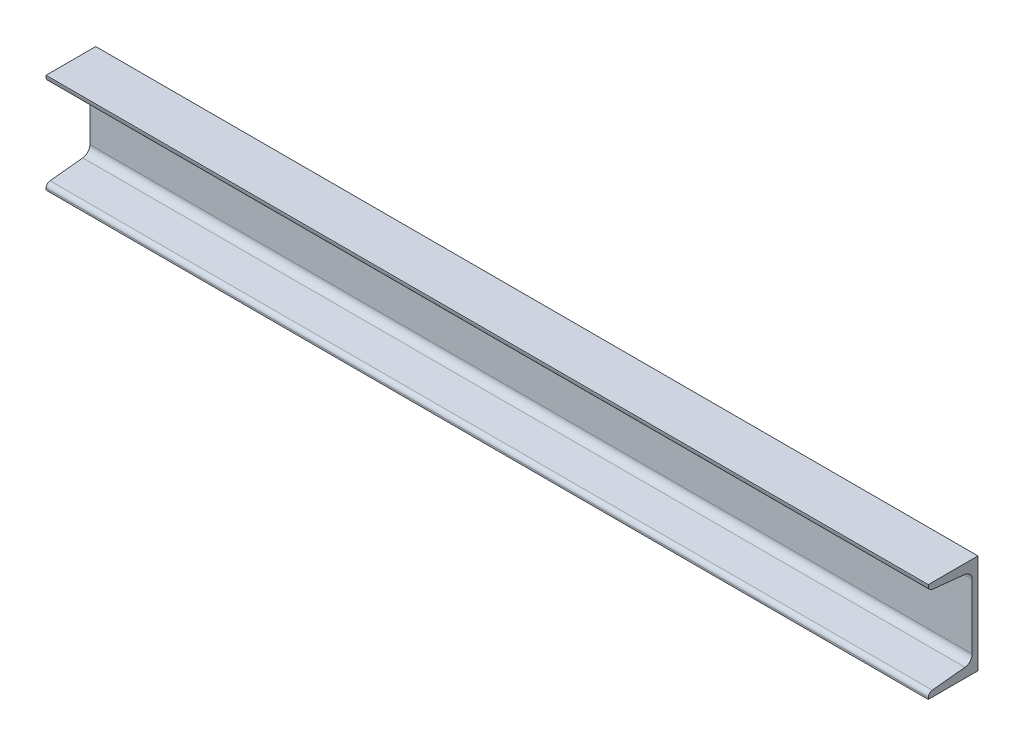
ISO-10303-21;
HEADER;
FILE_DESCRIPTION(('STEP AP214'),'2;1');
FILE_NAME('part.step','',(''),(''),'','','');
FILE_SCHEMA(('AUTOMOTIVE_DESIGN { 1 0 10303 214 1 1 1 1 }'));
ENDSEC;
DATA;
#1=APPLICATION_CONTEXT('core data for automotive mechanical design processes');
#2=APPLICATION_PROTOCOL_DEFINITION('international standard','automotive_design',2000,#1);
#3=PRODUCT_CONTEXT('',#1,'mechanical');
#4=PRODUCT('Part','Part','',(#3));
#5=PRODUCT_RELATED_PRODUCT_CATEGORY('part','',(#4));
#6=PRODUCT_DEFINITION_FORMATION('','',#4);
#7=PRODUCT_DEFINITION_CONTEXT('part definition',#1,'design');
#8=PRODUCT_DEFINITION('design','',#6,#7);
#9=PRODUCT_DEFINITION_SHAPE('','',#8);
#10=(LENGTH_UNIT() NAMED_UNIT(*) SI_UNIT(.MILLI.,.METRE.));
#11=(NAMED_UNIT(*) PLANE_ANGLE_UNIT() SI_UNIT($,.RADIAN.));
#12=(NAMED_UNIT(*) SI_UNIT($,.STERADIAN.) SOLID_ANGLE_UNIT());
#13=UNCERTAINTY_MEASURE_WITH_UNIT(LENGTH_MEASURE(1.E-05),#10,'distance_accuracy_value','');
#14=(GEOMETRIC_REPRESENTATION_CONTEXT(3) GLOBAL_UNCERTAINTY_ASSIGNED_CONTEXT((#13)) GLOBAL_UNIT_ASSIGNED_CONTEXT((#10,
#11,#12)) REPRESENTATION_CONTEXT('',''));
#15=CARTESIAN_POINT('',(0.,0.,0.));
#16=DIRECTION('',(0.,0.,1.));
#17=DIRECTION('',(1.,0.,0.));
#18=AXIS2_PLACEMENT_3D('',#15,#16,#17);
#19=CARTESIAN_POINT('',(-887.,98.3701473289391,45.5000000000001));
#20=DIRECTION('',(1.,0.,0.));
#21=DIRECTION('',(0.,0.,-1.));
#22=AXIS2_PLACEMENT_3D('',#19,#20,#21);
#23=CYLINDRICAL_SURFACE('',#22,4.50000000000001);
#24=CARTESIAN_POINT('',(0.,98.3701473289391,45.5));
#25=DIRECTION('',(-1.,0.,0.));
#26=DIRECTION('',(0.,0.,1.));
#27=AXIS2_PLACEMENT_3D('',#24,#25,#26);
#28=CIRCLE('',#27,4.50000000000001);
#29=CARTESIAN_POINT('',(0.,93.8947987997818,45.9703780847044));
#30=VERTEX_POINT('',#29);
#31=CARTESIAN_POINT('',(0.,98.3701473289391,50.));
#32=VERTEX_POINT('',#31);
#33=EDGE_CURVE('E200',#30,#32,#28,.T.);
#34=ORIENTED_EDGE('',*,*,#33,.T.);
#35=DIRECTION('',(1.,0.,0.));
#36=VECTOR('',#35,1.);
#37=CARTESIAN_POINT('',(-887.,98.3701473289391,50.0000000000001));
#38=LINE('',#37,#36);
#39=CARTESIAN_POINT('',(-887.,98.3701473289391,50.0000000000001));
#40=VERTEX_POINT('',#39);
#41=EDGE_CURVE('E13',#40,#32,#38,.T.);
#42=ORIENTED_EDGE('',*,*,#41,.F.);
#43=CARTESIAN_POINT('',(-887.,98.3701473289391,45.5000000000001));
#44=DIRECTION('',(-1.,0.,0.));
#45=DIRECTION('',(0.,0.,1.));
#46=AXIS2_PLACEMENT_3D('',#43,#44,#45);
#47=CIRCLE('',#46,4.50000000000001);
#48=CARTESIAN_POINT('',(-887.,93.8947987997818,45.9703780847045));
#49=VERTEX_POINT('',#48);
#50=EDGE_CURVE('E222',#49,#40,#47,.T.);
#51=ORIENTED_EDGE('',*,*,#50,.F.);
#52=DIRECTION('',(1.,0.,0.));
#53=VECTOR('',#52,1.);
#54=CARTESIAN_POINT('',(-887.,93.8947987997818,45.9703780847045));
#55=LINE('',#54,#53);
#56=EDGE_CURVE('E196',#49,#30,#55,.T.);
#57=ORIENTED_EDGE('',*,*,#56,.T.);
#58=EDGE_LOOP('',(#34,#42,#51,#57));
#59=FACE_BOUND('',#58,.T.);
#60=ADVANCED_FACE('F80',(#59),#23,.T.);
#61=CARTESIAN_POINT('',(-887.,100.,50.0000000000001));
#62=DIRECTION('',(0.,0.,-1.));
#63=DIRECTION('',(0.,1.,0.));
#64=AXIS2_PLACEMENT_3D('',#61,#62,#63);
#65=PLANE('',#64);
#66=DIRECTION('',(0.,1.,0.));
#67=VECTOR('',#66,1.);
#68=CARTESIAN_POINT('',(0.,100.,50.));
#69=LINE('',#68,#67);
#70=CARTESIAN_POINT('',(0.,100.,50.));
#71=VERTEX_POINT('',#70);
#72=EDGE_CURVE('E203',#32,#71,#69,.T.);
#73=ORIENTED_EDGE('',*,*,#72,.T.);
#74=DIRECTION('',(1.,0.,0.));
#75=VECTOR('',#74,1.);
#76=CARTESIAN_POINT('',(-887.,100.,50.0000000000001));
#77=LINE('',#76,#75);
#78=CARTESIAN_POINT('',(-887.,100.,50.0000000000001));
#79=VERTEX_POINT('',#78);
#80=EDGE_CURVE('E88',#79,#71,#77,.T.);
#81=ORIENTED_EDGE('',*,*,#80,.F.);
#82=DIRECTION('',(0.,1.,0.));
#83=VECTOR('',#82,1.);
#84=CARTESIAN_POINT('',(-887.,100.,50.0000000000001));
#85=LINE('',#84,#83);
#86=EDGE_CURVE('E151',#40,#79,#85,.T.);
#87=ORIENTED_EDGE('',*,*,#86,.F.);
#88=ORIENTED_EDGE('',*,*,#41,.T.);
#89=EDGE_LOOP('',(#73,#81,#87,#88));
#90=FACE_BOUND('',#89,.T.);
#91=ADVANCED_FACE('F300',(#90),#65,.F.);
#92=CARTESIAN_POINT('',(-887.,100.,50.0000000000001));
#93=DIRECTION('',(0.,-1.,0.));
#94=DIRECTION('',(0.,0.,-1.));
#95=AXIS2_PLACEMENT_3D('',#92,#93,#94);
#96=PLANE('',#95);
#97=DIRECTION('',(0.,0.,-1.));
#98=VECTOR('',#97,1.);
#99=CARTESIAN_POINT('',(0.,100.,50.));
#100=LINE('',#99,#98);
#101=CARTESIAN_POINT('',(0.,100.,0.));
#102=VERTEX_POINT('',#101);
#103=EDGE_CURVE('E205',#71,#102,#100,.T.);
#104=ORIENTED_EDGE('',*,*,#103,.T.);
#105=DIRECTION('',(1.,0.,0.));
#106=VECTOR('',#105,1.);
#107=CARTESIAN_POINT('',(-887.,100.,1.05930844483571E-13));
#108=LINE('',#107,#106);
#109=CARTESIAN_POINT('',(-887.,100.,1.05930844483571E-13));
#110=VERTEX_POINT('',#109);
#111=EDGE_CURVE('E241',#110,#102,#108,.T.);
#112=ORIENTED_EDGE('',*,*,#111,.F.);
#113=DIRECTION('',(0.,0.,-1.));
#114=VECTOR('',#113,1.);
#115=CARTESIAN_POINT('',(-887.,100.,50.0000000000001));
#116=LINE('',#115,#114);
#117=EDGE_CURVE('E249',#79,#110,#116,.T.);
#118=ORIENTED_EDGE('',*,*,#117,.F.);
#119=ORIENTED_EDGE('',*,*,#80,.T.);
#120=EDGE_LOOP('',(#104,#112,#118,#119));
#121=FACE_BOUND('',#120,.T.);
#122=ADVANCED_FACE('F247',(#121),#96,.F.);
#123=CARTESIAN_POINT('',(-887.,100.,1.05930844483571E-13));
#124=DIRECTION('',(0.,0.,1.));
#125=DIRECTION('',(1.,0.,0.));
#126=AXIS2_PLACEMENT_3D('',#123,#124,#125);
#127=PLANE('',#126);
#128=DIRECTION('',(0.,-1.,0.));
#129=VECTOR('',#128,1.);
#130=CARTESIAN_POINT('',(0.,100.,0.));
#131=LINE('',#130,#129);
#132=CARTESIAN_POINT('',(0.,0.,0.));
#133=VERTEX_POINT('',#132);
#134=EDGE_CURVE('E207',#102,#133,#131,.T.);
#135=ORIENTED_EDGE('',*,*,#134,.T.);
#136=DIRECTION('',(1.,0.,0.));
#137=VECTOR('',#136,1.);
#138=CARTESIAN_POINT('',(-887.,0.,1.0862617108437E-13));
#139=LINE('',#138,#137);
#140=CARTESIAN_POINT('',(-887.,0.,1.0862617108437E-13));
#141=VERTEX_POINT('',#140);
#142=EDGE_CURVE('E238',#141,#133,#139,.T.);
#143=ORIENTED_EDGE('',*,*,#142,.F.);
#144=DIRECTION('',(0.,-1.,0.));
#145=VECTOR('',#144,1.);
#146=CARTESIAN_POINT('',(-887.,100.,1.05930844483571E-13));
#147=LINE('',#146,#145);
#148=EDGE_CURVE('E267',#110,#141,#147,.T.);
#149=ORIENTED_EDGE('',*,*,#148,.F.);
#150=ORIENTED_EDGE('',*,*,#111,.T.);
#151=EDGE_LOOP('',(#135,#143,#149,#150));
#152=FACE_BOUND('',#151,.T.);
#153=ADVANCED_FACE('F258',(#152),#127,.F.);
#154=CARTESIAN_POINT('',(-887.,0.,50.0000000000001));
#155=DIRECTION('',(0.,1.,0.));
#156=DIRECTION('',(0.,0.,1.));
#157=AXIS2_PLACEMENT_3D('',#154,#155,#156);
#158=PLANE('',#157);
#159=DIRECTION('',(0.,0.,1.));
#160=VECTOR('',#159,1.);
#161=CARTESIAN_POINT('',(0.,0.,50.));
#162=LINE('',#161,#160);
#163=CARTESIAN_POINT('',(0.,0.,50.));
#164=VERTEX_POINT('',#163);
#165=EDGE_CURVE('E209',#133,#164,#162,.T.);
#166=ORIENTED_EDGE('',*,*,#165,.T.);
#167=DIRECTION('',(1.,0.,0.));
#168=VECTOR('',#167,1.);
#169=CARTESIAN_POINT('',(-887.,0.,50.0000000000001));
#170=LINE('',#169,#168);
#171=CARTESIAN_POINT('',(-887.,0.,50.0000000000001));
#172=VERTEX_POINT('',#171);
#173=EDGE_CURVE('E235',#172,#164,#170,.T.);
#174=ORIENTED_EDGE('',*,*,#173,.F.);
#175=DIRECTION('',(0.,0.,1.));
#176=VECTOR('',#175,1.);
#177=CARTESIAN_POINT('',(-887.,0.,50.0000000000001));
#178=LINE('',#177,#176);
#179=EDGE_CURVE('E264',#141,#172,#178,.T.);
#180=ORIENTED_EDGE('',*,*,#179,.F.);
#181=ORIENTED_EDGE('',*,*,#142,.T.);
#182=EDGE_LOOP('',(#166,#174,#180,#181));
#183=FACE_BOUND('',#182,.T.);
#184=ADVANCED_FACE('F262',(#183),#158,.F.);
#185=CARTESIAN_POINT('',(-887.,0.,50.0000000000001));
#186=DIRECTION('',(0.,0.,-1.));
#187=DIRECTION('',(-1.,0.,0.));
#188=AXIS2_PLACEMENT_3D('',#185,#186,#187);
#189=PLANE('',#188);
#190=DIRECTION('',(0.,1.,0.));
#191=VECTOR('',#190,1.);
#192=CARTESIAN_POINT('',(0.,0.,50.));
#193=LINE('',#192,#191);
#194=CARTESIAN_POINT('',(0.,1.6298526710609,50.));
#195=VERTEX_POINT('',#194);
#196=EDGE_CURVE('E211',#164,#195,#193,.T.);
#197=ORIENTED_EDGE('',*,*,#196,.T.);
#198=DIRECTION('',(1.,0.,0.));
#199=VECTOR('',#198,1.);
#200=CARTESIAN_POINT('',(-887.,1.6298526710609,50.0000000000001));
#201=LINE('',#200,#199);
#202=CARTESIAN_POINT('',(-887.,1.6298526710609,50.0000000000001));
#203=VERTEX_POINT('',#202);
#204=EDGE_CURVE('E232',#203,#195,#201,.T.);
#205=ORIENTED_EDGE('',*,*,#204,.F.);
#206=DIRECTION('',(0.,1.,0.));
#207=VECTOR('',#206,1.);
#208=CARTESIAN_POINT('',(-887.,0.,50.0000000000001));
#209=LINE('',#208,#207);
#210=EDGE_CURVE('E266',#172,#203,#209,.T.);
#211=ORIENTED_EDGE('',*,*,#210,.F.);
#212=ORIENTED_EDGE('',*,*,#173,.T.);
#213=EDGE_LOOP('',(#197,#205,#211,#212));
#214=FACE_BOUND('',#213,.T.);
#215=ADVANCED_FACE('F313',(#214),#189,.F.);
#216=CARTESIAN_POINT('',(-887.,1.6298526710609,45.5000000000001));
#217=DIRECTION('',(1.,0.,0.));
#218=DIRECTION('',(0.,0.,-1.));
#219=AXIS2_PLACEMENT_3D('',#216,#217,#218);
#220=CYLINDRICAL_SURFACE('',#219,4.5);
#221=CARTESIAN_POINT('',(0.,1.6298526710609,45.5));
#222=DIRECTION('',(-1.,0.,0.));
#223=DIRECTION('',(0.,0.,-1.));
#224=AXIS2_PLACEMENT_3D('',#221,#222,#223);
#225=CIRCLE('',#224,4.5);
#226=CARTESIAN_POINT('',(0.,6.10520120021813,45.9703780847044));
#227=VERTEX_POINT('',#226);
#228=EDGE_CURVE('E213',#195,#227,#225,.T.);
#229=ORIENTED_EDGE('',*,*,#228,.T.);
#230=DIRECTION('',(1.,0.,0.));
#231=VECTOR('',#230,1.);
#232=CARTESIAN_POINT('',(-887.,6.10520120021813,45.9703780847045));
#233=LINE('',#232,#231);
#234=CARTESIAN_POINT('',(-887.,6.10520120021813,45.9703780847045));
#235=VERTEX_POINT('',#234);
#236=EDGE_CURVE('E229',#235,#227,#233,.T.);
#237=ORIENTED_EDGE('',*,*,#236,.F.);
#238=CARTESIAN_POINT('',(-887.,1.6298526710609,45.5000000000001));
#239=DIRECTION('',(-1.,0.,0.));
#240=DIRECTION('',(0.,0.,-1.));
#241=AXIS2_PLACEMENT_3D('',#238,#239,#240);
#242=CIRCLE('',#241,4.5);
#243=EDGE_CURVE('E269',#203,#235,#242,.T.);
#244=ORIENTED_EDGE('',*,*,#243,.F.);
#245=ORIENTED_EDGE('',*,*,#204,.T.);
#246=EDGE_LOOP('',(#229,#237,#244,#245));
#247=FACE_BOUND('',#246,.T.);
#248=ADVANCED_FACE('F316',(#247),#220,.T.);
#249=CARTESIAN_POINT('',(-887.,9.56382483705383,13.0637722938589));
#250=DIRECTION('',(0.,-0.994521895368274,-0.104528463267647));
#251=DIRECTION('',(0.,0.104528463267647,-0.994521895368274));
#252=AXIS2_PLACEMENT_3D('',#249,#250,#251);
#253=PLANE('',#252);
#254=DIRECTION('',(0.,0.104528463267647,-0.994521895368274));
#255=VECTOR('',#254,1.);
#256=CARTESIAN_POINT('',(0.,9.56382483705383,13.0637722938588));
#257=LINE('',#256,#255);
#258=CARTESIAN_POINT('',(0.,9.56382483705383,13.0637722938588));
#259=VERTEX_POINT('',#258);
#260=EDGE_CURVE('E215',#227,#259,#257,.T.);
#261=ORIENTED_EDGE('',*,*,#260,.T.);
#262=DIRECTION('',(1.,0.,0.));
#263=VECTOR('',#262,1.);
#264=CARTESIAN_POINT('',(-887.,9.56382483705383,13.0637722938589));
#265=LINE('',#264,#263);
#266=CARTESIAN_POINT('',(-887.,9.56382483705383,13.0637722938589));
#267=VERTEX_POINT('',#266);
#268=EDGE_CURVE('E226',#267,#259,#265,.T.);
#269=ORIENTED_EDGE('',*,*,#268,.F.);
#270=DIRECTION('',(0.,0.104528463267647,-0.994521895368274));
#271=VECTOR('',#270,1.);
#272=CARTESIAN_POINT('',(-887.,9.56382483705383,13.0637722938589));
#273=LINE('',#272,#271);
#274=EDGE_CURVE('E275',#235,#267,#273,.T.);
#275=ORIENTED_EDGE('',*,*,#274,.F.);
#276=ORIENTED_EDGE('',*,*,#236,.T.);
#277=EDGE_LOOP('',(#261,#269,#275,#276));
#278=FACE_BOUND('',#277,.T.);
#279=ADVANCED_FACE('F281',(#278),#253,.F.);
#280=CARTESIAN_POINT('',(-887.,17.52,13.9000000000001));
#281=DIRECTION('',(1.,0.,0.));
#282=DIRECTION('',(0.,0.,-1.));
#283=AXIS2_PLACEMENT_3D('',#280,#281,#282);
#284=CYLINDRICAL_SURFACE('',#283,8.);
#285=CARTESIAN_POINT('',(0.,17.52,13.9));
#286=DIRECTION('',(1.,0.,0.));
#287=DIRECTION('',(0.,0.,1.));
#288=AXIS2_PLACEMENT_3D('',#285,#286,#287);
#289=CIRCLE('',#288,8.);
#290=CARTESIAN_POINT('',(0.,17.52,5.90000000000001));
#291=VERTEX_POINT('',#290);
#292=EDGE_CURVE('E217',#259,#291,#289,.T.);
#293=ORIENTED_EDGE('',*,*,#292,.T.);
#294=DIRECTION('',(1.,0.,0.));
#295=VECTOR('',#294,1.);
#296=CARTESIAN_POINT('',(-887.,17.52,5.90000000000012));
#297=LINE('',#296,#295);
#298=CARTESIAN_POINT('',(-887.,17.52,5.90000000000012));
#299=VERTEX_POINT('',#298);
#300=EDGE_CURVE('E191',#299,#291,#297,.T.);
#301=ORIENTED_EDGE('',*,*,#300,.F.);
#302=CARTESIAN_POINT('',(-887.,17.52,13.9000000000001));
#303=DIRECTION('',(1.,0.,0.));
#304=DIRECTION('',(0.,0.,1.));
#305=AXIS2_PLACEMENT_3D('',#302,#303,#304);
#306=CIRCLE('',#305,8.);
#307=EDGE_CURVE('E182',#267,#299,#306,.T.);
#308=ORIENTED_EDGE('',*,*,#307,.F.);
#309=ORIENTED_EDGE('',*,*,#268,.T.);
#310=EDGE_LOOP('',(#293,#301,#308,#309));
#311=FACE_BOUND('',#310,.T.);
#312=ADVANCED_FACE('F285',(#311),#284,.F.);
#313=CARTESIAN_POINT('',(-887.,82.48,5.90000000000011));
#314=DIRECTION('',(0.,0.,-1.));
#315=DIRECTION('',(0.,1.,0.));
#316=AXIS2_PLACEMENT_3D('',#313,#314,#315);
#317=PLANE('',#316);
#318=DIRECTION('',(0.,1.,0.));
#319=VECTOR('',#318,1.);
#320=CARTESIAN_POINT('',(0.,82.48,5.9));
#321=LINE('',#320,#319);
#322=CARTESIAN_POINT('',(0.,82.48,5.9));
#323=VERTEX_POINT('',#322);
#324=EDGE_CURVE('E190',#291,#323,#321,.T.);
#325=ORIENTED_EDGE('',*,*,#324,.T.);
#326=DIRECTION('',(1.,0.,0.));
#327=VECTOR('',#326,1.);
#328=CARTESIAN_POINT('',(-887.,82.48,5.90000000000011));
#329=LINE('',#328,#327);
#330=CARTESIAN_POINT('',(-887.,82.48,5.90000000000011));
#331=VERTEX_POINT('',#330);
#332=EDGE_CURVE('E187',#331,#323,#329,.T.);
#333=ORIENTED_EDGE('',*,*,#332,.F.);
#334=DIRECTION('',(0.,1.,0.));
#335=VECTOR('',#334,1.);
#336=CARTESIAN_POINT('',(-887.,82.48,5.90000000000011));
#337=LINE('',#336,#335);
#338=EDGE_CURVE('E176',#299,#331,#337,.T.);
#339=ORIENTED_EDGE('',*,*,#338,.F.);
#340=ORIENTED_EDGE('',*,*,#300,.T.);
#341=EDGE_LOOP('',(#325,#333,#339,#340));
#342=FACE_BOUND('',#341,.T.);
#343=ADVANCED_FACE('F188',(#342),#317,.F.);
#344=CARTESIAN_POINT('',(-887.,82.48,13.9000000000001));
#345=DIRECTION('',(1.,0.,0.));
#346=DIRECTION('',(0.,0.,-1.));
#347=AXIS2_PLACEMENT_3D('',#344,#345,#346);
#348=CYLINDRICAL_SURFACE('',#347,8.);
#349=CARTESIAN_POINT('',(0.,82.48,13.9));
#350=DIRECTION('',(1.,0.,0.));
#351=DIRECTION('',(0.,0.,-1.));
#352=AXIS2_PLACEMENT_3D('',#349,#350,#351);
#353=CIRCLE('',#352,8.);
#354=CARTESIAN_POINT('',(0.,90.4361751629462,13.0637722938588));
#355=VERTEX_POINT('',#354);
#356=EDGE_CURVE('E137',#323,#355,#353,.T.);
#357=ORIENTED_EDGE('',*,*,#356,.T.);
#358=DIRECTION('',(1.,0.,0.));
#359=VECTOR('',#358,1.);
#360=CARTESIAN_POINT('',(-887.,90.4361751629462,13.0637722938589));
#361=LINE('',#360,#359);
#362=CARTESIAN_POINT('',(-887.,90.4361751629462,13.0637722938589));
#363=VERTEX_POINT('',#362);
#364=EDGE_CURVE('E192',#363,#355,#361,.T.);
#365=ORIENTED_EDGE('',*,*,#364,.F.);
#366=CARTESIAN_POINT('',(-887.,82.48,13.9000000000001));
#367=DIRECTION('',(1.,0.,0.));
#368=DIRECTION('',(0.,0.,-1.));
#369=AXIS2_PLACEMENT_3D('',#366,#367,#368);
#370=CIRCLE('',#369,8.);
#371=EDGE_CURVE('E180',#331,#363,#370,.T.);
#372=ORIENTED_EDGE('',*,*,#371,.F.);
#373=ORIENTED_EDGE('',*,*,#332,.T.);
#374=EDGE_LOOP('',(#357,#365,#372,#373));
#375=FACE_BOUND('',#374,.T.);
#376=ADVANCED_FACE('F194',(#375),#348,.F.);
#377=CARTESIAN_POINT('',(-887.,90.4361751629462,13.0637722938589));
#378=DIRECTION('',(0.,0.994521895368274,-0.104528463267645));
#379=DIRECTION('',(0.,0.104528463267645,0.994521895368274));
#380=AXIS2_PLACEMENT_3D('',#377,#378,#379);
#381=PLANE('',#380);
#382=DIRECTION('',(0.,0.104528463267645,0.994521895368274));
#383=VECTOR('',#382,1.);
#384=CARTESIAN_POINT('',(0.,90.4361751629462,13.0637722938588));
#385=LINE('',#384,#383);
#386=EDGE_CURVE('E143',#355,#30,#385,.T.);
#387=ORIENTED_EDGE('',*,*,#386,.T.);
#388=ORIENTED_EDGE('',*,*,#56,.F.);
#389=DIRECTION('',(0.,0.104528463267645,0.994521895368274));
#390=VECTOR('',#389,1.);
#391=CARTESIAN_POINT('',(-887.,90.4361751629462,13.0637722938589));
#392=LINE('',#391,#390);
#393=EDGE_CURVE('E96',#363,#49,#392,.T.);
#394=ORIENTED_EDGE('',*,*,#393,.F.);
#395=ORIENTED_EDGE('',*,*,#364,.T.);
#396=EDGE_LOOP('',(#387,#388,#394,#395));
#397=FACE_BOUND('',#396,.T.);
#398=ADVANCED_FACE('F289',(#397),#381,.F.);
#399=CARTESIAN_POINT('',(-887.,98.3701473289391,45.5000000000001));
#400=DIRECTION('',(-1.,0.,0.));
#401=DIRECTION('',(0.,0.,1.));
#402=AXIS2_PLACEMENT_3D('',#399,#400,#401);
#403=PLANE('',#402);
#404=ORIENTED_EDGE('',*,*,#50,.T.);
#405=ORIENTED_EDGE('',*,*,#86,.T.);
#406=ORIENTED_EDGE('',*,*,#117,.T.);
#407=ORIENTED_EDGE('',*,*,#148,.T.);
#408=ORIENTED_EDGE('',*,*,#179,.T.);
#409=ORIENTED_EDGE('',*,*,#210,.T.);
#410=ORIENTED_EDGE('',*,*,#243,.T.);
#411=ORIENTED_EDGE('',*,*,#274,.T.);
#412=ORIENTED_EDGE('',*,*,#307,.T.);
#413=ORIENTED_EDGE('',*,*,#338,.T.);
#414=ORIENTED_EDGE('',*,*,#371,.T.);
#415=ORIENTED_EDGE('',*,*,#393,.T.);
#416=EDGE_LOOP('',(#404,#405,#406,#407,#408,#409,#410,#411,#412,#413,#414,#415));
#417=FACE_BOUND('',#416,.T.);
#418=ADVANCED_FACE('F178',(#417),#403,.T.);
#419=CARTESIAN_POINT('',(0.,98.3701473289391,45.5));
#420=DIRECTION('',(-1.,0.,0.));
#421=DIRECTION('',(0.,0.,1.));
#422=AXIS2_PLACEMENT_3D('',#419,#420,#421);
#423=PLANE('',#422);
#424=ORIENTED_EDGE('',*,*,#33,.F.);
#425=ORIENTED_EDGE('',*,*,#386,.F.);
#426=ORIENTED_EDGE('',*,*,#356,.F.);
#427=ORIENTED_EDGE('',*,*,#324,.F.);
#428=ORIENTED_EDGE('',*,*,#292,.F.);
#429=ORIENTED_EDGE('',*,*,#260,.F.);
#430=ORIENTED_EDGE('',*,*,#228,.F.);
#431=ORIENTED_EDGE('',*,*,#196,.F.);
#432=ORIENTED_EDGE('',*,*,#165,.F.);
#433=ORIENTED_EDGE('',*,*,#134,.F.);
#434=ORIENTED_EDGE('',*,*,#103,.F.);
#435=ORIENTED_EDGE('',*,*,#72,.F.);
#436=EDGE_LOOP('',(#424,#425,#426,#427,#428,#429,#430,#431,#432,#433,#434,#435));
#437=FACE_BOUND('',#436,.T.);
#438=ADVANCED_FACE('F253',(#437),#423,.F.);
#439=CLOSED_SHELL('',(#60,#91,#122,#153,#184,#215,#248,#279,#312,#343,#376,#398,#418,#438));
#440=MANIFOLD_SOLID_BREP('B2',#439);
#441=ADVANCED_BREP_SHAPE_REPRESENTATION('',(#18,#440),#14);
#442=SHAPE_DEFINITION_REPRESENTATION(#9,#441);
ENDSEC;
END-ISO-10303-21;
